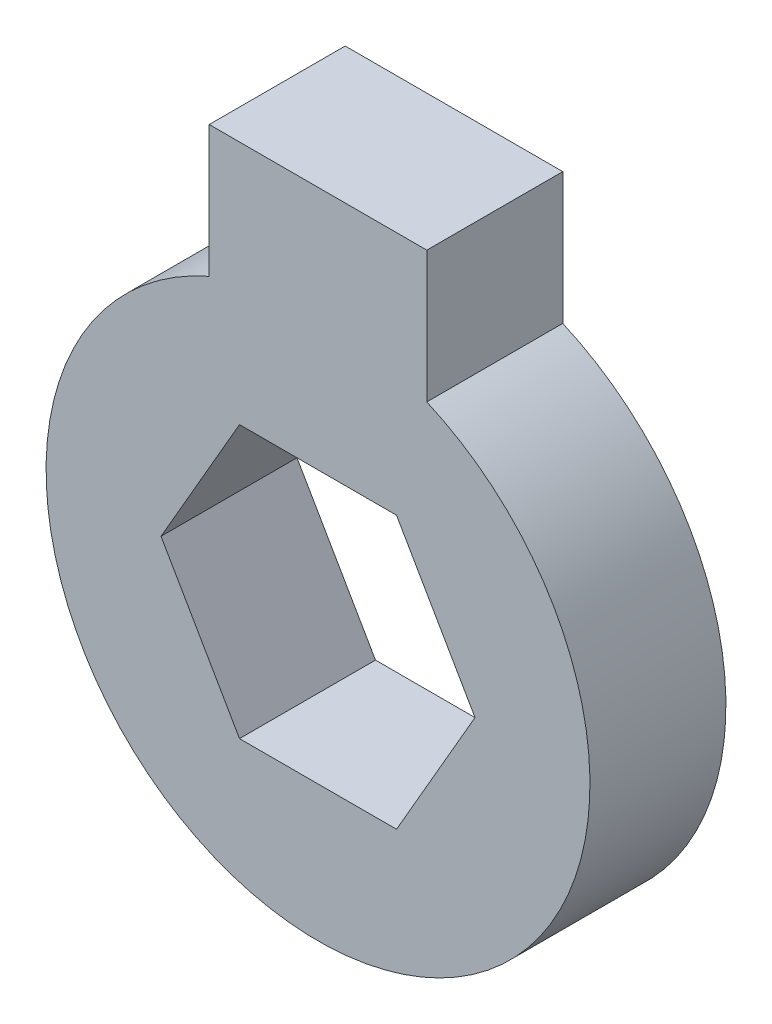
ISO-10303-21;
HEADER;
FILE_DESCRIPTION(('STEP AP214'),'2;1');
FILE_NAME('part.step','',(''),(''),'','','');
FILE_SCHEMA(('AUTOMOTIVE_DESIGN { 1 0 10303 214 1 1 1 1 }'));
ENDSEC;
DATA;
#1=APPLICATION_CONTEXT('core data for automotive mechanical design processes');
#2=APPLICATION_PROTOCOL_DEFINITION('international standard','automotive_design',2000,#1);
#3=PRODUCT_CONTEXT('',#1,'mechanical');
#4=PRODUCT('Part','Part','',(#3));
#5=PRODUCT_RELATED_PRODUCT_CATEGORY('part','',(#4));
#6=PRODUCT_DEFINITION_FORMATION('','',#4);
#7=PRODUCT_DEFINITION_CONTEXT('part definition',#1,'design');
#8=PRODUCT_DEFINITION('design','',#6,#7);
#9=PRODUCT_DEFINITION_SHAPE('','',#8);
#10=(LENGTH_UNIT() NAMED_UNIT(*) SI_UNIT(.MILLI.,.METRE.));
#11=(NAMED_UNIT(*) PLANE_ANGLE_UNIT() SI_UNIT($,.RADIAN.));
#12=(NAMED_UNIT(*) SI_UNIT($,.STERADIAN.) SOLID_ANGLE_UNIT());
#13=UNCERTAINTY_MEASURE_WITH_UNIT(LENGTH_MEASURE(1.E-05),#10,'distance_accuracy_value','');
#14=(GEOMETRIC_REPRESENTATION_CONTEXT(3) GLOBAL_UNCERTAINTY_ASSIGNED_CONTEXT((#13)) GLOBAL_UNIT_ASSIGNED_CONTEXT((#10,
#11,#12)) REPRESENTATION_CONTEXT('',''));
#15=CARTESIAN_POINT('',(0.,0.,0.));
#16=DIRECTION('',(0.,0.,1.));
#17=DIRECTION('',(1.,0.,0.));
#18=AXIS2_PLACEMENT_3D('',#15,#16,#17);
#19=CARTESIAN_POINT('',(0.,0.,6.35));
#20=DIRECTION('',(0.,0.,1.));
#21=DIRECTION('',(1.,0.,0.));
#22=AXIS2_PLACEMENT_3D('',#19,#20,#21);
#23=PLANE('',#22);
#24=DIRECTION('',(0.,-1.,0.));
#25=VECTOR('',#24,1.);
#26=CARTESIAN_POINT('',(-5.08,17.78,6.35));
#27=LINE('',#26,#25);
#28=CARTESIAN_POINT('',(-5.08,17.78,6.35));
#29=VERTEX_POINT('',#28);
#30=CARTESIAN_POINT('',(-5.08,11.6397422651878,6.35));
#31=VERTEX_POINT('',#30);
#32=EDGE_CURVE('E164',#29,#31,#27,.T.);
#33=ORIENTED_EDGE('',*,*,#32,.T.);
#34=CARTESIAN_POINT('',(0.,0.,6.35));
#35=DIRECTION('',(0.,0.,1.));
#36=DIRECTION('',(1.,0.,0.));
#37=AXIS2_PLACEMENT_3D('',#34,#35,#36);
#38=CIRCLE('',#37,12.7);
#39=CARTESIAN_POINT('',(5.08,11.6397422651878,6.35));
#40=VERTEX_POINT('',#39);
#41=EDGE_CURVE('E167',#31,#40,#38,.T.);
#42=ORIENTED_EDGE('',*,*,#41,.T.);
#43=DIRECTION('',(0.,1.,0.));
#44=VECTOR('',#43,1.);
#45=CARTESIAN_POINT('',(5.08,17.78,6.35));
#46=LINE('',#45,#44);
#47=CARTESIAN_POINT('',(5.08,17.78,6.35));
#48=VERTEX_POINT('',#47);
#49=EDGE_CURVE('E170',#40,#48,#46,.T.);
#50=ORIENTED_EDGE('',*,*,#49,.T.);
#51=DIRECTION('',(-1.,0.,0.));
#52=VECTOR('',#51,1.);
#53=CARTESIAN_POINT('',(-5.08,17.78,6.35));
#54=LINE('',#53,#52);
#55=EDGE_CURVE('E172',#48,#29,#54,.T.);
#56=ORIENTED_EDGE('',*,*,#55,.T.);
#57=EDGE_LOOP('',(#33,#42,#50,#56));
#58=FACE_BOUND('',#57,.T.);
#59=DIRECTION('',(-0.500000000000001,0.866025403784438,0.));
#60=VECTOR('',#59,1.);
#61=CARTESIAN_POINT('',(7.33234841870825,0.,6.35));
#62=LINE('',#61,#60);
#63=CARTESIAN_POINT('',(7.33234841870825,0.,6.35));
#64=VERTEX_POINT('',#63);
#65=CARTESIAN_POINT('',(3.66617420935411,6.35000000000001,6.35));
#66=VERTEX_POINT('',#65);
#67=EDGE_CURVE('E121',#64,#66,#62,.T.);
#68=ORIENTED_EDGE('',*,*,#67,.F.);
#69=DIRECTION('',(0.499999999999995,0.866025403784442,0.));
#70=VECTOR('',#69,1.);
#71=CARTESIAN_POINT('',(3.6661742093542,-6.34999999999996,6.35));
#72=LINE('',#71,#70);
#73=CARTESIAN_POINT('',(3.6661742093542,-6.34999999999996,6.35));
#74=VERTEX_POINT('',#73);
#75=EDGE_CURVE('E113',#74,#64,#72,.T.);
#76=ORIENTED_EDGE('',*,*,#75,.F.);
#77=DIRECTION('',(1.,0.,0.));
#78=VECTOR('',#77,1.);
#79=CARTESIAN_POINT('',(-3.66617420935407,-6.35000000000004,6.35));
#80=LINE('',#79,#78);
#81=CARTESIAN_POINT('',(-3.66617420935407,-6.35000000000004,6.35));
#82=VERTEX_POINT('',#81);
#83=EDGE_CURVE('E142',#82,#74,#80,.T.);
#84=ORIENTED_EDGE('',*,*,#83,.F.);
#85=DIRECTION('',(0.500000000000007,-0.866025403784435,0.));
#86=VECTOR('',#85,1.);
#87=CARTESIAN_POINT('',(-7.33234841870825,0.,6.35));
#88=LINE('',#87,#86);
#89=CARTESIAN_POINT('',(-7.33234841870825,0.,6.35));
#90=VERTEX_POINT('',#89);
#91=EDGE_CURVE('E140',#90,#82,#88,.T.);
#92=ORIENTED_EDGE('',*,*,#91,.F.);
#93=DIRECTION('',(-0.499999999999995,-0.866025403784442,0.));
#94=VECTOR('',#93,1.);
#95=CARTESIAN_POINT('',(-3.66617420935416,6.34999999999999,6.35));
#96=LINE('',#95,#94);
#97=CARTESIAN_POINT('',(-3.66617420935416,6.34999999999999,6.35));
#98=VERTEX_POINT('',#97);
#99=EDGE_CURVE('E136',#98,#90,#96,.T.);
#100=ORIENTED_EDGE('',*,*,#99,.F.);
#101=DIRECTION('',(-1.,0.,0.));
#102=VECTOR('',#101,1.);
#103=CARTESIAN_POINT('',(3.66617420935411,6.35000000000001,6.35));
#104=LINE('',#103,#102);
#105=EDGE_CURVE('E134',#66,#98,#104,.T.);
#106=ORIENTED_EDGE('',*,*,#105,.F.);
#107=EDGE_LOOP('',(#68,#76,#84,#92,#100,#106));
#108=FACE_BOUND('',#107,.T.);
#109=ADVANCED_FACE('F36',(#58,#108),#23,.T.);
#110=CARTESIAN_POINT('',(0.,0.,0.));
#111=DIRECTION('',(0.,0.,1.));
#112=DIRECTION('',(1.,0.,0.));
#113=AXIS2_PLACEMENT_3D('',#110,#111,#112);
#114=PLANE('',#113);
#115=DIRECTION('',(0.,-1.,0.));
#116=VECTOR('',#115,1.);
#117=CARTESIAN_POINT('',(-5.08,17.78,0.));
#118=LINE('',#117,#116);
#119=CARTESIAN_POINT('',(-5.08,17.78,0.));
#120=VERTEX_POINT('',#119);
#121=CARTESIAN_POINT('',(-5.08,11.6397422651878,0.));
#122=VERTEX_POINT('',#121);
#123=EDGE_CURVE('E129',#120,#122,#118,.T.);
#124=ORIENTED_EDGE('',*,*,#123,.F.);
#125=DIRECTION('',(-1.,0.,0.));
#126=VECTOR('',#125,1.);
#127=CARTESIAN_POINT('',(-5.08,17.78,0.));
#128=LINE('',#127,#126);
#129=CARTESIAN_POINT('',(5.08,17.78,0.));
#130=VERTEX_POINT('',#129);
#131=EDGE_CURVE('E168',#130,#120,#128,.T.);
#132=ORIENTED_EDGE('',*,*,#131,.F.);
#133=DIRECTION('',(0.,1.,0.));
#134=VECTOR('',#133,1.);
#135=CARTESIAN_POINT('',(5.08,17.78,0.));
#136=LINE('',#135,#134);
#137=CARTESIAN_POINT('',(5.08,11.6397422651878,0.));
#138=VERTEX_POINT('',#137);
#139=EDGE_CURVE('E179',#138,#130,#136,.T.);
#140=ORIENTED_EDGE('',*,*,#139,.F.);
#141=CARTESIAN_POINT('',(0.,0.,0.));
#142=DIRECTION('',(0.,0.,1.));
#143=DIRECTION('',(1.,0.,0.));
#144=AXIS2_PLACEMENT_3D('',#141,#142,#143);
#145=CIRCLE('',#144,12.7);
#146=EDGE_CURVE('E177',#122,#138,#145,.T.);
#147=ORIENTED_EDGE('',*,*,#146,.F.);
#148=EDGE_LOOP('',(#124,#132,#140,#147));
#149=FACE_BOUND('',#148,.T.);
#150=DIRECTION('',(0.499999999999995,0.866025403784442,0.));
#151=VECTOR('',#150,1.);
#152=CARTESIAN_POINT('',(3.6661742093542,-6.34999999999996,0.));
#153=LINE('',#152,#151);
#154=CARTESIAN_POINT('',(3.6661742093542,-6.34999999999996,0.));
#155=VERTEX_POINT('',#154);
#156=CARTESIAN_POINT('',(7.33234841870825,0.,0.));
#157=VERTEX_POINT('',#156);
#158=EDGE_CURVE('E59',#155,#157,#153,.T.);
#159=ORIENTED_EDGE('',*,*,#158,.T.);
#160=DIRECTION('',(-0.500000000000001,0.866025403784438,0.));
#161=VECTOR('',#160,1.);
#162=CARTESIAN_POINT('',(7.33234841870825,0.,0.));
#163=LINE('',#162,#161);
#164=CARTESIAN_POINT('',(3.66617420935411,6.35000000000001,0.));
#165=VERTEX_POINT('',#164);
#166=EDGE_CURVE('E128',#157,#165,#163,.T.);
#167=ORIENTED_EDGE('',*,*,#166,.T.);
#168=DIRECTION('',(-1.,0.,0.));
#169=VECTOR('',#168,1.);
#170=CARTESIAN_POINT('',(3.66617420935411,6.35000000000001,0.));
#171=LINE('',#170,#169);
#172=CARTESIAN_POINT('',(-3.66617420935416,6.34999999999999,0.));
#173=VERTEX_POINT('',#172);
#174=EDGE_CURVE('E146',#165,#173,#171,.T.);
#175=ORIENTED_EDGE('',*,*,#174,.T.);
#176=DIRECTION('',(-0.499999999999995,-0.866025403784442,0.));
#177=VECTOR('',#176,1.);
#178=CARTESIAN_POINT('',(-3.66617420935416,6.34999999999999,0.));
#179=LINE('',#178,#177);
#180=CARTESIAN_POINT('',(-7.33234841870825,0.,0.));
#181=VERTEX_POINT('',#180);
#182=EDGE_CURVE('E149',#173,#181,#179,.T.);
#183=ORIENTED_EDGE('',*,*,#182,.T.);
#184=DIRECTION('',(0.500000000000007,-0.866025403784435,0.));
#185=VECTOR('',#184,1.);
#186=CARTESIAN_POINT('',(-7.33234841870825,0.,0.));
#187=LINE('',#186,#185);
#188=CARTESIAN_POINT('',(-3.66617420935407,-6.35000000000004,0.));
#189=VERTEX_POINT('',#188);
#190=EDGE_CURVE('E152',#181,#189,#187,.T.);
#191=ORIENTED_EDGE('',*,*,#190,.T.);
#192=DIRECTION('',(1.,0.,0.));
#193=VECTOR('',#192,1.);
#194=CARTESIAN_POINT('',(-3.66617420935407,-6.35000000000004,0.));
#195=LINE('',#194,#193);
#196=EDGE_CURVE('E122',#189,#155,#195,.T.);
#197=ORIENTED_EDGE('',*,*,#196,.T.);
#198=EDGE_LOOP('',(#159,#167,#175,#183,#191,#197));
#199=FACE_BOUND('',#198,.T.);
#200=ADVANCED_FACE('F197',(#149,#199),#114,.F.);
#201=CARTESIAN_POINT('',(-5.08,17.78,6.35));
#202=DIRECTION('',(1.,0.,0.));
#203=DIRECTION('',(0.,0.,-1.));
#204=AXIS2_PLACEMENT_3D('',#201,#202,#203);
#205=PLANE('',#204);
#206=ORIENTED_EDGE('',*,*,#123,.T.);
#207=DIRECTION('',(0.,0.,-1.));
#208=VECTOR('',#207,1.);
#209=CARTESIAN_POINT('',(-5.08,11.6397422651878,6.35));
#210=LINE('',#209,#208);
#211=EDGE_CURVE('E11',#31,#122,#210,.T.);
#212=ORIENTED_EDGE('',*,*,#211,.F.);
#213=ORIENTED_EDGE('',*,*,#32,.F.);
#214=DIRECTION('',(0.,0.,-1.));
#215=VECTOR('',#214,1.);
#216=CARTESIAN_POINT('',(-5.08,17.78,6.35));
#217=LINE('',#216,#215);
#218=EDGE_CURVE('E174',#29,#120,#217,.T.);
#219=ORIENTED_EDGE('',*,*,#218,.T.);
#220=EDGE_LOOP('',(#206,#212,#213,#219));
#221=FACE_BOUND('',#220,.T.);
#222=ADVANCED_FACE('F38',(#221),#205,.F.);
#223=CARTESIAN_POINT('',(0.,0.,6.35));
#224=DIRECTION('',(0.,0.,-1.));
#225=DIRECTION('',(-1.,0.,0.));
#226=AXIS2_PLACEMENT_3D('',#223,#224,#225);
#227=CYLINDRICAL_SURFACE('',#226,12.7);
#228=ORIENTED_EDGE('',*,*,#146,.T.);
#229=DIRECTION('',(0.,0.,-1.));
#230=VECTOR('',#229,1.);
#231=CARTESIAN_POINT('',(5.08,11.6397422651878,6.35));
#232=LINE('',#231,#230);
#233=EDGE_CURVE('E44',#40,#138,#232,.T.);
#234=ORIENTED_EDGE('',*,*,#233,.F.);
#235=ORIENTED_EDGE('',*,*,#41,.F.);
#236=ORIENTED_EDGE('',*,*,#211,.T.);
#237=EDGE_LOOP('',(#228,#234,#235,#236));
#238=FACE_BOUND('',#237,.T.);
#239=ADVANCED_FACE('F207',(#238),#227,.T.);
#240=CARTESIAN_POINT('',(5.08,17.78,6.35));
#241=DIRECTION('',(-1.,0.,0.));
#242=DIRECTION('',(0.,0.,1.));
#243=AXIS2_PLACEMENT_3D('',#240,#241,#242);
#244=PLANE('',#243);
#245=ORIENTED_EDGE('',*,*,#139,.T.);
#246=DIRECTION('',(0.,0.,-1.));
#247=VECTOR('',#246,1.);
#248=CARTESIAN_POINT('',(5.08,17.78,6.35));
#249=LINE('',#248,#247);
#250=EDGE_CURVE('E184',#48,#130,#249,.T.);
#251=ORIENTED_EDGE('',*,*,#250,.F.);
#252=ORIENTED_EDGE('',*,*,#49,.F.);
#253=ORIENTED_EDGE('',*,*,#233,.T.);
#254=EDGE_LOOP('',(#245,#251,#252,#253));
#255=FACE_BOUND('',#254,.T.);
#256=ADVANCED_FACE('F191',(#255),#244,.F.);
#257=CARTESIAN_POINT('',(-5.08,17.78,6.35));
#258=DIRECTION('',(0.,-1.,0.));
#259=DIRECTION('',(0.,0.,-1.));
#260=AXIS2_PLACEMENT_3D('',#257,#258,#259);
#261=PLANE('',#260);
#262=ORIENTED_EDGE('',*,*,#131,.T.);
#263=ORIENTED_EDGE('',*,*,#218,.F.);
#264=ORIENTED_EDGE('',*,*,#55,.F.);
#265=ORIENTED_EDGE('',*,*,#250,.T.);
#266=EDGE_LOOP('',(#262,#263,#264,#265));
#267=FACE_BOUND('',#266,.T.);
#268=ADVANCED_FACE('F201',(#267),#261,.F.);
#269=CARTESIAN_POINT('',(3.6661742093542,-6.34999999999996,6.35));
#270=DIRECTION('',(-0.866025403784441,0.499999999999995,0.));
#271=DIRECTION('',(-0.499999999999995,-0.866025403784442,0.));
#272=AXIS2_PLACEMENT_3D('',#269,#270,#271);
#273=PLANE('',#272);
#274=ORIENTED_EDGE('',*,*,#158,.F.);
#275=DIRECTION('',(0.,0.,-1.));
#276=VECTOR('',#275,1.);
#277=CARTESIAN_POINT('',(3.6661742093542,-6.34999999999996,6.35));
#278=LINE('',#277,#276);
#279=EDGE_CURVE('E117',#74,#155,#278,.T.);
#280=ORIENTED_EDGE('',*,*,#279,.F.);
#281=ORIENTED_EDGE('',*,*,#75,.T.);
#282=DIRECTION('',(0.,0.,-1.));
#283=VECTOR('',#282,1.);
#284=CARTESIAN_POINT('',(7.33234841870825,0.,6.35));
#285=LINE('',#284,#283);
#286=EDGE_CURVE('E116',#64,#157,#285,.T.);
#287=ORIENTED_EDGE('',*,*,#286,.T.);
#288=EDGE_LOOP('',(#274,#280,#281,#287));
#289=FACE_BOUND('',#288,.T.);
#290=ADVANCED_FACE('F115',(#289),#273,.T.);
#291=CARTESIAN_POINT('',(7.33234841870825,0.,6.35));
#292=DIRECTION('',(-0.866025403784438,-0.500000000000001,0.));
#293=DIRECTION('',(0.500000000000001,-0.866025403784438,0.));
#294=AXIS2_PLACEMENT_3D('',#291,#292,#293);
#295=PLANE('',#294);
#296=ORIENTED_EDGE('',*,*,#166,.F.);
#297=ORIENTED_EDGE('',*,*,#286,.F.);
#298=ORIENTED_EDGE('',*,*,#67,.T.);
#299=DIRECTION('',(0.,0.,-1.));
#300=VECTOR('',#299,1.);
#301=CARTESIAN_POINT('',(3.66617420935411,6.35000000000001,6.35));
#302=LINE('',#301,#300);
#303=EDGE_CURVE('E130',#66,#165,#302,.T.);
#304=ORIENTED_EDGE('',*,*,#303,.T.);
#305=EDGE_LOOP('',(#296,#297,#298,#304));
#306=FACE_BOUND('',#305,.T.);
#307=ADVANCED_FACE('F125',(#306),#295,.T.);
#308=CARTESIAN_POINT('',(3.66617420935411,6.35000000000001,6.35));
#309=DIRECTION('',(0.,-1.,0.));
#310=DIRECTION('',(1.,0.,0.));
#311=AXIS2_PLACEMENT_3D('',#308,#309,#310);
#312=PLANE('',#311);
#313=ORIENTED_EDGE('',*,*,#174,.F.);
#314=ORIENTED_EDGE('',*,*,#303,.F.);
#315=ORIENTED_EDGE('',*,*,#105,.T.);
#316=DIRECTION('',(0.,0.,-1.));
#317=VECTOR('',#316,1.);
#318=CARTESIAN_POINT('',(-3.66617420935416,6.34999999999999,6.35));
#319=LINE('',#318,#317);
#320=EDGE_CURVE('E161',#98,#173,#319,.T.);
#321=ORIENTED_EDGE('',*,*,#320,.T.);
#322=EDGE_LOOP('',(#313,#314,#315,#321));
#323=FACE_BOUND('',#322,.T.);
#324=ADVANCED_FACE('F230',(#323),#312,.T.);
#325=CARTESIAN_POINT('',(-3.66617420935416,6.34999999999999,6.35));
#326=DIRECTION('',(0.866025403784442,-0.499999999999995,0.));
#327=DIRECTION('',(0.499999999999995,0.866025403784442,0.));
#328=AXIS2_PLACEMENT_3D('',#325,#326,#327);
#329=PLANE('',#328);
#330=ORIENTED_EDGE('',*,*,#182,.F.);
#331=ORIENTED_EDGE('',*,*,#320,.F.);
#332=ORIENTED_EDGE('',*,*,#99,.T.);
#333=DIRECTION('',(0.,0.,-1.));
#334=VECTOR('',#333,1.);
#335=CARTESIAN_POINT('',(-7.33234841870825,0.,6.35));
#336=LINE('',#335,#334);
#337=EDGE_CURVE('E159',#90,#181,#336,.T.);
#338=ORIENTED_EDGE('',*,*,#337,.T.);
#339=EDGE_LOOP('',(#330,#331,#332,#338));
#340=FACE_BOUND('',#339,.T.);
#341=ADVANCED_FACE('F234',(#340),#329,.T.);
#342=CARTESIAN_POINT('',(-7.33234841870825,0.,6.35));
#343=DIRECTION('',(0.866025403784435,0.500000000000007,0.));
#344=DIRECTION('',(-0.500000000000007,0.866025403784435,0.));
#345=AXIS2_PLACEMENT_3D('',#342,#343,#344);
#346=PLANE('',#345);
#347=ORIENTED_EDGE('',*,*,#190,.F.);
#348=ORIENTED_EDGE('',*,*,#337,.F.);
#349=ORIENTED_EDGE('',*,*,#91,.T.);
#350=DIRECTION('',(0.,0.,-1.));
#351=VECTOR('',#350,1.);
#352=CARTESIAN_POINT('',(-3.66617420935407,-6.35000000000004,6.35));
#353=LINE('',#352,#351);
#354=EDGE_CURVE('E51',#82,#189,#353,.T.);
#355=ORIENTED_EDGE('',*,*,#354,.T.);
#356=EDGE_LOOP('',(#347,#348,#349,#355));
#357=FACE_BOUND('',#356,.T.);
#358=ADVANCED_FACE('F240',(#357),#346,.T.);
#359=CARTESIAN_POINT('',(-3.66617420935407,-6.35000000000004,6.35));
#360=DIRECTION('',(0.,1.,0.));
#361=DIRECTION('',(-1.,0.,0.));
#362=AXIS2_PLACEMENT_3D('',#359,#360,#361);
#363=PLANE('',#362);
#364=ORIENTED_EDGE('',*,*,#196,.F.);
#365=ORIENTED_EDGE('',*,*,#354,.F.);
#366=ORIENTED_EDGE('',*,*,#83,.T.);
#367=ORIENTED_EDGE('',*,*,#279,.T.);
#368=EDGE_LOOP('',(#364,#365,#366,#367));
#369=FACE_BOUND('',#368,.T.);
#370=ADVANCED_FACE('F244',(#369),#363,.T.);
#371=CLOSED_SHELL('',(#109,#200,#222,#239,#256,#268,#290,#307,#324,#341,#358,#370));
#372=MANIFOLD_SOLID_BREP('B2',#371);
#373=ADVANCED_BREP_SHAPE_REPRESENTATION('',(#18,#372),#14);
#374=SHAPE_DEFINITION_REPRESENTATION(#9,#373);
ENDSEC;
END-ISO-10303-21;
